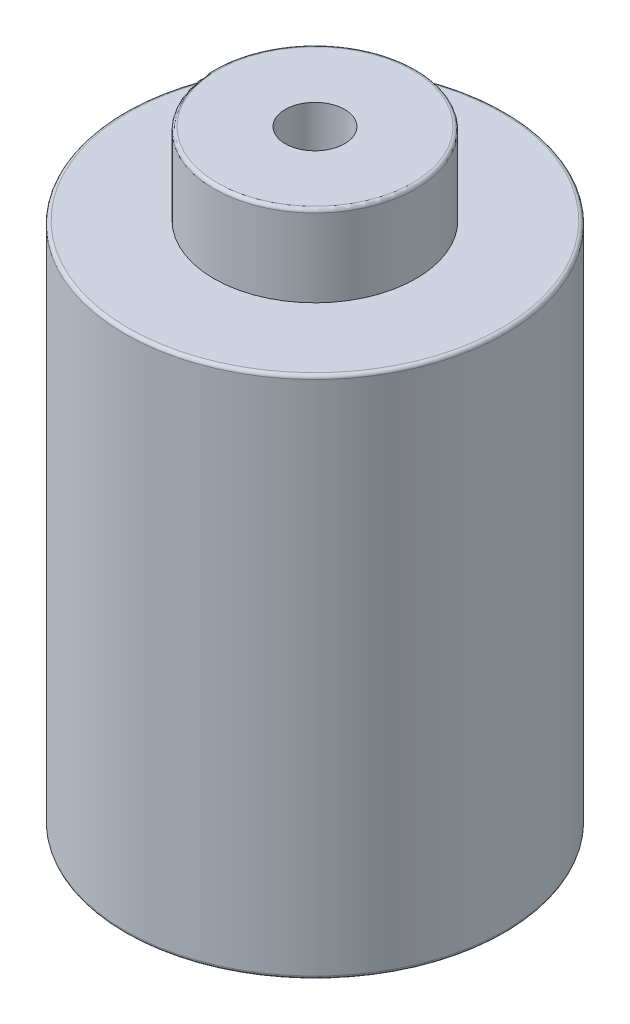
ISO-10303-21;
HEADER;
FILE_DESCRIPTION(('STEP AP214'),'2;1');
FILE_NAME('part.step','',(''),(''),'','','');
FILE_SCHEMA(('AUTOMOTIVE_DESIGN { 1 0 10303 214 1 1 1 1 }'));
ENDSEC;
DATA;
#1=APPLICATION_CONTEXT('core data for automotive mechanical design processes');
#2=APPLICATION_PROTOCOL_DEFINITION('international standard','automotive_design',2000,#1);
#3=PRODUCT_CONTEXT('',#1,'mechanical');
#4=PRODUCT('Part','Part','',(#3));
#5=PRODUCT_RELATED_PRODUCT_CATEGORY('part','',(#4));
#6=PRODUCT_DEFINITION_FORMATION('','',#4);
#7=PRODUCT_DEFINITION_CONTEXT('part definition',#1,'design');
#8=PRODUCT_DEFINITION('design','',#6,#7);
#9=PRODUCT_DEFINITION_SHAPE('','',#8);
#10=(LENGTH_UNIT() NAMED_UNIT(*) SI_UNIT(.MILLI.,.METRE.));
#11=(NAMED_UNIT(*) PLANE_ANGLE_UNIT() SI_UNIT($,.RADIAN.));
#12=(NAMED_UNIT(*) SI_UNIT($,.STERADIAN.) SOLID_ANGLE_UNIT());
#13=UNCERTAINTY_MEASURE_WITH_UNIT(LENGTH_MEASURE(1.E-05),#10,'distance_accuracy_value','');
#14=(GEOMETRIC_REPRESENTATION_CONTEXT(3) GLOBAL_UNCERTAINTY_ASSIGNED_CONTEXT((#13)) GLOBAL_UNIT_ASSIGNED_CONTEXT((#10,
#11,#12)) REPRESENTATION_CONTEXT('',''));
#15=CARTESIAN_POINT('',(0.,0.,0.));
#16=DIRECTION('',(0.,0.,1.));
#17=DIRECTION('',(1.,0.,0.));
#18=AXIS2_PLACEMENT_3D('',#15,#16,#17);
#19=CARTESIAN_POINT('',(0.,44.45,0.));
#20=DIRECTION('',(0.,1.,0.));
#21=DIRECTION('',(0.,0.,1.));
#22=AXIS2_PLACEMENT_3D('',#19,#20,#21);
#23=PLANE('',#22);
#24=CARTESIAN_POINT('',(0.,44.45,0.));
#25=DIRECTION('',(0.,1.,0.));
#26=DIRECTION('',(0.,0.,1.));
#27=AXIS2_PLACEMENT_3D('',#24,#25,#26);
#28=CIRCLE('',#27,7.1755);
#29=CARTESIAN_POINT('',(0.,44.45,7.1755));
#30=VERTEX_POINT('',#29);
#31=EDGE_CURVE('E37',#30,#30,#28,.T.);
#32=ORIENTED_EDGE('',*,*,#31,.T.);
#33=EDGE_LOOP('',(#32));
#34=FACE_BOUND('',#33,.T.);
#35=CARTESIAN_POINT('',(0.,44.45,0.));
#36=DIRECTION('',(0.,1.,0.));
#37=DIRECTION('',(0.,0.,1.));
#38=AXIS2_PLACEMENT_3D('',#35,#36,#37);
#39=CIRCLE('',#38,2.1844);
#40=CARTESIAN_POINT('',(0.,44.45,2.1844));
#41=VERTEX_POINT('',#40);
#42=EDGE_CURVE('E56',#41,#41,#39,.T.);
#43=ORIENTED_EDGE('',*,*,#42,.F.);
#44=EDGE_LOOP('',(#43));
#45=FACE_BOUND('',#44,.T.);
#46=ADVANCED_FACE('F30',(#34,#45),#23,.T.);
#47=CARTESIAN_POINT('',(0.,44.45,0.));
#48=DIRECTION('',(0.,-1.,0.));
#49=DIRECTION('',(0.,0.,-1.));
#50=AXIS2_PLACEMENT_3D('',#47,#48,#49);
#51=CYLINDRICAL_SURFACE('',#50,13.97);
#52=CARTESIAN_POINT('',(0.,0.253999999999997,0.));
#53=DIRECTION('',(0.,1.,0.));
#54=DIRECTION('',(0.,0.,1.));
#55=AXIS2_PLACEMENT_3D('',#52,#53,#54);
#56=CIRCLE('',#55,13.97);
#57=CARTESIAN_POINT('',(0.,0.253999999999997,13.97));
#58=VERTEX_POINT('',#57);
#59=EDGE_CURVE('E50',#58,#58,#56,.T.);
#60=ORIENTED_EDGE('',*,*,#59,.T.);
#61=EDGE_LOOP('',(#60));
#62=FACE_BOUND('',#61,.T.);
#63=CARTESIAN_POINT('',(0.,38.227,0.));
#64=DIRECTION('',(0.,1.,0.));
#65=DIRECTION('',(0.,0.,1.));
#66=AXIS2_PLACEMENT_3D('',#63,#64,#65);
#67=CIRCLE('',#66,13.97);
#68=CARTESIAN_POINT('',(0.,38.227,13.97));
#69=VERTEX_POINT('',#68);
#70=EDGE_CURVE('E53',#69,#69,#67,.F.);
#71=ORIENTED_EDGE('',*,*,#70,.T.);
#72=EDGE_LOOP('',(#71));
#73=FACE_BOUND('',#72,.T.);
#74=ADVANCED_FACE('F83',(#62,#73),#51,.T.);
#75=CARTESIAN_POINT('',(0.,0.,0.));
#76=DIRECTION('',(0.,1.,0.));
#77=DIRECTION('',(0.,0.,1.));
#78=AXIS2_PLACEMENT_3D('',#75,#76,#77);
#79=PLANE('',#78);
#80=CARTESIAN_POINT('',(0.,0.,0.));
#81=DIRECTION('',(0.,1.,0.));
#82=DIRECTION('',(0.,0.,1.));
#83=AXIS2_PLACEMENT_3D('',#80,#81,#82);
#84=CIRCLE('',#83,13.716);
#85=CARTESIAN_POINT('',(0.,0.,13.716));
#86=VERTEX_POINT('',#85);
#87=EDGE_CURVE('E45',#86,#86,#84,.F.);
#88=ORIENTED_EDGE('',*,*,#87,.T.);
#89=EDGE_LOOP('',(#88));
#90=FACE_BOUND('',#89,.T.);
#91=CARTESIAN_POINT('',(0.,0.,0.));
#92=DIRECTION('',(0.,1.,0.));
#93=DIRECTION('',(0.,0.,1.));
#94=AXIS2_PLACEMENT_3D('',#91,#92,#93);
#95=CIRCLE('',#94,2.1844);
#96=CARTESIAN_POINT('',(0.,0.,2.1844));
#97=VERTEX_POINT('',#96);
#98=EDGE_CURVE('E57',#97,#97,#95,.T.);
#99=ORIENTED_EDGE('',*,*,#98,.T.);
#100=EDGE_LOOP('',(#99));
#101=FACE_BOUND('',#100,.T.);
#102=ADVANCED_FACE('F79',(#90,#101),#79,.F.);
#103=CARTESIAN_POINT('',(0.,44.45,0.));
#104=DIRECTION('',(0.,-1.,0.));
#105=DIRECTION('',(0.,0.,-1.));
#106=AXIS2_PLACEMENT_3D('',#103,#104,#105);
#107=CYLINDRICAL_SURFACE('',#106,2.1844);
#108=ORIENTED_EDGE('',*,*,#42,.T.);
#109=EDGE_LOOP('',(#108));
#110=FACE_BOUND('',#109,.T.);
#111=ORIENTED_EDGE('',*,*,#98,.F.);
#112=EDGE_LOOP('',(#111));
#113=FACE_BOUND('',#112,.T.);
#114=ADVANCED_FACE('F70',(#110,#113),#107,.F.);
#115=CARTESIAN_POINT('',(0.,38.481,0.));
#116=DIRECTION('',(0.,1.,0.));
#117=DIRECTION('',(0.,0.,1.));
#118=AXIS2_PLACEMENT_3D('',#115,#116,#117);
#119=PLANE('',#118);
#120=CARTESIAN_POINT('',(0.,38.481,0.));
#121=DIRECTION('',(0.,1.,0.));
#122=DIRECTION('',(0.,0.,1.));
#123=AXIS2_PLACEMENT_3D('',#120,#121,#122);
#124=CIRCLE('',#123,13.716);
#125=CARTESIAN_POINT('',(0.,38.481,13.716));
#126=VERTEX_POINT('',#125);
#127=EDGE_CURVE('E41',#126,#126,#124,.T.);
#128=ORIENTED_EDGE('',*,*,#127,.T.);
#129=EDGE_LOOP('',(#128));
#130=FACE_BOUND('',#129,.T.);
#131=CARTESIAN_POINT('',(0.,38.481,0.));
#132=DIRECTION('',(0.,1.,0.));
#133=DIRECTION('',(0.,0.,1.));
#134=AXIS2_PLACEMENT_3D('',#131,#132,#133);
#135=CIRCLE('',#134,7.4295);
#136=CARTESIAN_POINT('',(0.,38.481,7.4295));
#137=VERTEX_POINT('',#136);
#138=EDGE_CURVE('E60',#137,#137,#135,.T.);
#139=ORIENTED_EDGE('',*,*,#138,.F.);
#140=EDGE_LOOP('',(#139));
#141=FACE_BOUND('',#140,.T.);
#142=ADVANCED_FACE('F68',(#130,#141),#119,.T.);
#143=CARTESIAN_POINT('',(0.,38.481,0.));
#144=DIRECTION('',(0.,1.,0.));
#145=DIRECTION('',(0.,0.,1.));
#146=AXIS2_PLACEMENT_3D('',#143,#144,#145);
#147=CYLINDRICAL_SURFACE('',#146,7.4295);
#148=CARTESIAN_POINT('',(0.,44.196,0.));
#149=DIRECTION('',(0.,1.,0.));
#150=DIRECTION('',(0.,0.,1.));
#151=AXIS2_PLACEMENT_3D('',#148,#149,#150);
#152=CIRCLE('',#151,7.4295);
#153=CARTESIAN_POINT('',(0.,44.196,7.4295));
#154=VERTEX_POINT('',#153);
#155=EDGE_CURVE('E10',#154,#154,#152,.F.);
#156=ORIENTED_EDGE('',*,*,#155,.T.);
#157=EDGE_LOOP('',(#156));
#158=FACE_BOUND('',#157,.T.);
#159=ORIENTED_EDGE('',*,*,#138,.T.);
#160=EDGE_LOOP('',(#159));
#161=FACE_BOUND('',#160,.T.);
#162=ADVANCED_FACE('F66',(#158,#161),#147,.T.);
#163=CARTESIAN_POINT('',(0.,0.253999999999997,0.));
#164=DIRECTION('',(0.,1.,0.));
#165=DIRECTION('',(0.,0.,1.));
#166=AXIS2_PLACEMENT_3D('',#163,#164,#165);
#167=TOROIDAL_SURFACE('',#166,13.716,0.254);
#168=ORIENTED_EDGE('',*,*,#87,.F.);
#169=EDGE_LOOP('',(#168));
#170=FACE_BOUND('',#169,.T.);
#171=ORIENTED_EDGE('',*,*,#59,.F.);
#172=EDGE_LOOP('',(#171));
#173=FACE_BOUND('',#172,.T.);
#174=ADVANCED_FACE('F77',(#170,#173),#167,.T.);
#175=CARTESIAN_POINT('',(0.,38.227,0.));
#176=DIRECTION('',(0.,1.,0.));
#177=DIRECTION('',(0.,0.,1.));
#178=AXIS2_PLACEMENT_3D('',#175,#176,#177);
#179=TOROIDAL_SURFACE('',#178,13.716,0.254);
#180=ORIENTED_EDGE('',*,*,#70,.F.);
#181=EDGE_LOOP('',(#180));
#182=FACE_BOUND('',#181,.T.);
#183=ORIENTED_EDGE('',*,*,#127,.F.);
#184=EDGE_LOOP('',(#183));
#185=FACE_BOUND('',#184,.T.);
#186=ADVANCED_FACE('F96',(#182,#185),#179,.T.);
#187=CARTESIAN_POINT('',(0.,44.196,0.));
#188=DIRECTION('',(0.,1.,0.));
#189=DIRECTION('',(0.,0.,1.));
#190=AXIS2_PLACEMENT_3D('',#187,#188,#189);
#191=TOROIDAL_SURFACE('',#190,7.1755,0.254);
#192=ORIENTED_EDGE('',*,*,#155,.F.);
#193=EDGE_LOOP('',(#192));
#194=FACE_BOUND('',#193,.T.);
#195=ORIENTED_EDGE('',*,*,#31,.F.);
#196=EDGE_LOOP('',(#195));
#197=FACE_BOUND('',#196,.T.);
#198=ADVANCED_FACE('F32',(#194,#197),#191,.T.);
#199=CLOSED_SHELL('',(#46,#74,#102,#114,#142,#162,#174,#186,#198));
#200=MANIFOLD_SOLID_BREP('B2',#199);
#201=ADVANCED_BREP_SHAPE_REPRESENTATION('',(#18,#200),#14);
#202=SHAPE_DEFINITION_REPRESENTATION(#9,#201);
ENDSEC;
END-ISO-10303-21;
